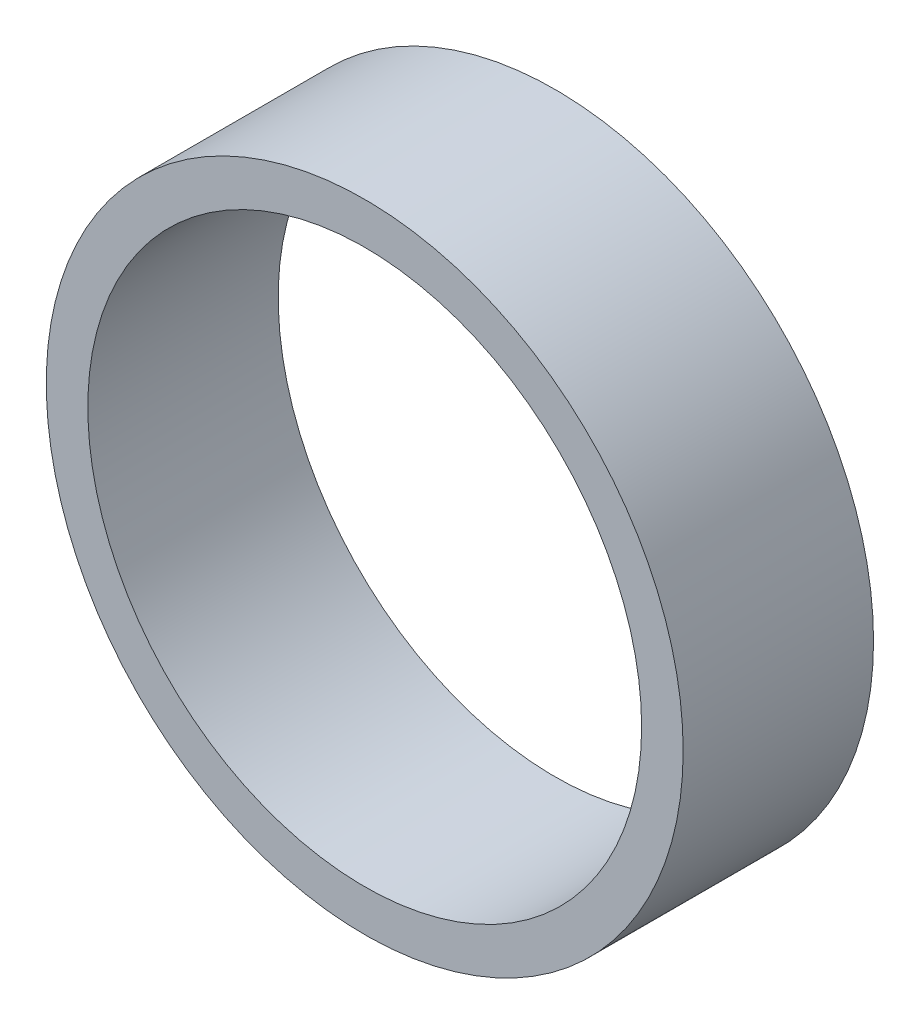
ISO-10303-21;
HEADER;
FILE_DESCRIPTION(('STEP AP214'),'2;1');
FILE_NAME('part.step','',(''),(''),'','','');
FILE_SCHEMA(('AUTOMOTIVE_DESIGN { 1 0 10303 214 1 1 1 1 }'));
ENDSEC;
DATA;
#1=APPLICATION_CONTEXT('core data for automotive mechanical design processes');
#2=APPLICATION_PROTOCOL_DEFINITION('international standard','automotive_design',2000,#1);
#3=PRODUCT_CONTEXT('',#1,'mechanical');
#4=PRODUCT('Part','Part','',(#3));
#5=PRODUCT_RELATED_PRODUCT_CATEGORY('part','',(#4));
#6=PRODUCT_DEFINITION_FORMATION('','',#4);
#7=PRODUCT_DEFINITION_CONTEXT('part definition',#1,'design');
#8=PRODUCT_DEFINITION('design','',#6,#7);
#9=PRODUCT_DEFINITION_SHAPE('','',#8);
#10=(LENGTH_UNIT() NAMED_UNIT(*) SI_UNIT(.MILLI.,.METRE.));
#11=(NAMED_UNIT(*) PLANE_ANGLE_UNIT() SI_UNIT($,.RADIAN.));
#12=(NAMED_UNIT(*) SI_UNIT($,.STERADIAN.) SOLID_ANGLE_UNIT());
#13=UNCERTAINTY_MEASURE_WITH_UNIT(LENGTH_MEASURE(1.E-05),#10,'distance_accuracy_value','');
#14=(GEOMETRIC_REPRESENTATION_CONTEXT(3) GLOBAL_UNCERTAINTY_ASSIGNED_CONTEXT((#13)) GLOBAL_UNIT_ASSIGNED_CONTEXT((#10,
#11,#12)) REPRESENTATION_CONTEXT('',''));
#15=CARTESIAN_POINT('',(0.,0.,0.));
#16=DIRECTION('',(0.,0.,1.));
#17=DIRECTION('',(1.,0.,0.));
#18=AXIS2_PLACEMENT_3D('',#15,#16,#17);
#19=CARTESIAN_POINT('',(0.,0.,5.5));
#20=DIRECTION('',(0.,0.,1.));
#21=DIRECTION('',(1.,0.,0.));
#22=AXIS2_PLACEMENT_3D('',#19,#20,#21);
#23=PLANE('',#22);
#24=CARTESIAN_POINT('',(0.,0.,5.5));
#25=DIRECTION('',(0.,0.,1.));
#26=DIRECTION('',(1.,0.,0.));
#27=AXIS2_PLACEMENT_3D('',#24,#25,#26);
#28=CIRCLE('',#27,9.2);
#29=CARTESIAN_POINT('',(9.2,0.,5.5));
#30=VERTEX_POINT('',#29);
#31=EDGE_CURVE('E10',#30,#30,#28,.T.);
#32=ORIENTED_EDGE('',*,*,#31,.T.);
#33=EDGE_LOOP('',(#32));
#34=FACE_BOUND('',#33,.T.);
#35=CARTESIAN_POINT('',(0.,0.,5.5));
#36=DIRECTION('',(0.,0.,1.));
#37=DIRECTION('',(1.,0.,0.));
#38=AXIS2_PLACEMENT_3D('',#35,#36,#37);
#39=CIRCLE('',#38,8.);
#40=CARTESIAN_POINT('',(8.,0.,5.5));
#41=VERTEX_POINT('',#40);
#42=EDGE_CURVE('E42',#41,#41,#39,.T.);
#43=ORIENTED_EDGE('',*,*,#42,.F.);
#44=EDGE_LOOP('',(#43));
#45=FACE_BOUND('',#44,.T.);
#46=ADVANCED_FACE('F31',(#34,#45),#23,.T.);
#47=CARTESIAN_POINT('',(0.,0.,0.));
#48=DIRECTION('',(0.,0.,1.));
#49=DIRECTION('',(1.,0.,0.));
#50=AXIS2_PLACEMENT_3D('',#47,#48,#49);
#51=PLANE('',#50);
#52=CARTESIAN_POINT('',(0.,0.,0.));
#53=DIRECTION('',(0.,0.,1.));
#54=DIRECTION('',(1.,0.,0.));
#55=AXIS2_PLACEMENT_3D('',#52,#53,#54);
#56=CIRCLE('',#55,9.2);
#57=CARTESIAN_POINT('',(9.2,0.,0.));
#58=VERTEX_POINT('',#57);
#59=EDGE_CURVE('E35',#58,#58,#56,.T.);
#60=ORIENTED_EDGE('',*,*,#59,.F.);
#61=EDGE_LOOP('',(#60));
#62=FACE_BOUND('',#61,.T.);
#63=CARTESIAN_POINT('',(0.,0.,0.));
#64=DIRECTION('',(0.,0.,1.));
#65=DIRECTION('',(1.,0.,0.));
#66=AXIS2_PLACEMENT_3D('',#63,#64,#65);
#67=CIRCLE('',#66,8.);
#68=CARTESIAN_POINT('',(8.,0.,0.));
#69=VERTEX_POINT('',#68);
#70=EDGE_CURVE('E44',#69,#69,#67,.T.);
#71=ORIENTED_EDGE('',*,*,#70,.T.);
#72=EDGE_LOOP('',(#71));
#73=FACE_BOUND('',#72,.T.);
#74=ADVANCED_FACE('F54',(#62,#73),#51,.F.);
#75=CARTESIAN_POINT('',(0.,0.,5.5));
#76=DIRECTION('',(0.,0.,-1.));
#77=DIRECTION('',(-1.,0.,0.));
#78=AXIS2_PLACEMENT_3D('',#75,#76,#77);
#79=CYLINDRICAL_SURFACE('',#78,9.2);
#80=ORIENTED_EDGE('',*,*,#31,.F.);
#81=EDGE_LOOP('',(#80));
#82=FACE_BOUND('',#81,.T.);
#83=ORIENTED_EDGE('',*,*,#59,.T.);
#84=EDGE_LOOP('',(#83));
#85=FACE_BOUND('',#84,.T.);
#86=ADVANCED_FACE('F33',(#82,#85),#79,.T.);
#87=CARTESIAN_POINT('',(0.,0.,5.5));
#88=DIRECTION('',(0.,0.,-1.));
#89=DIRECTION('',(-1.,0.,0.));
#90=AXIS2_PLACEMENT_3D('',#87,#88,#89);
#91=CYLINDRICAL_SURFACE('',#90,8.);
#92=ORIENTED_EDGE('',*,*,#42,.T.);
#93=EDGE_LOOP('',(#92));
#94=FACE_BOUND('',#93,.T.);
#95=ORIENTED_EDGE('',*,*,#70,.F.);
#96=EDGE_LOOP('',(#95));
#97=FACE_BOUND('',#96,.T.);
#98=ADVANCED_FACE('F50',(#94,#97),#91,.F.);
#99=CLOSED_SHELL('',(#46,#74,#86,#98));
#100=MANIFOLD_SOLID_BREP('B2',#99);
#101=ADVANCED_BREP_SHAPE_REPRESENTATION('',(#18,#100),#14);
#102=SHAPE_DEFINITION_REPRESENTATION(#9,#101);
ENDSEC;
END-ISO-10303-21;
